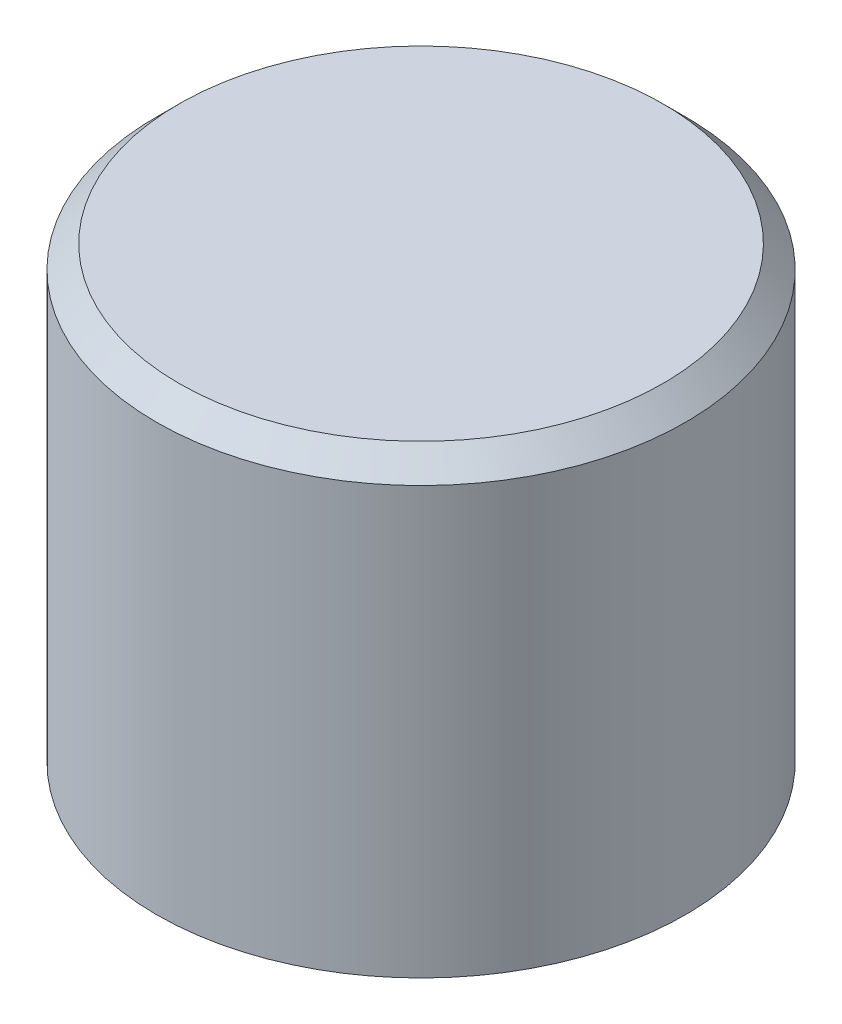
ISO-10303-21;
HEADER;
FILE_DESCRIPTION(('STEP AP214'),'2;1');
FILE_NAME('part.step','',(''),(''),'','','');
FILE_SCHEMA(('AUTOMOTIVE_DESIGN { 1 0 10303 214 1 1 1 1 }'));
ENDSEC;
DATA;
#1=APPLICATION_CONTEXT('core data for automotive mechanical design processes');
#2=APPLICATION_PROTOCOL_DEFINITION('international standard','automotive_design',2000,#1);
#3=PRODUCT_CONTEXT('',#1,'mechanical');
#4=PRODUCT('Part','Part','',(#3));
#5=PRODUCT_RELATED_PRODUCT_CATEGORY('part','',(#4));
#6=PRODUCT_DEFINITION_FORMATION('','',#4);
#7=PRODUCT_DEFINITION_CONTEXT('part definition',#1,'design');
#8=PRODUCT_DEFINITION('design','',#6,#7);
#9=PRODUCT_DEFINITION_SHAPE('','',#8);
#10=(LENGTH_UNIT() NAMED_UNIT(*) SI_UNIT(.MILLI.,.METRE.));
#11=(NAMED_UNIT(*) PLANE_ANGLE_UNIT() SI_UNIT($,.RADIAN.));
#12=(NAMED_UNIT(*) SI_UNIT($,.STERADIAN.) SOLID_ANGLE_UNIT());
#13=UNCERTAINTY_MEASURE_WITH_UNIT(LENGTH_MEASURE(1.E-05),#10,'distance_accuracy_value','');
#14=(GEOMETRIC_REPRESENTATION_CONTEXT(3) GLOBAL_UNCERTAINTY_ASSIGNED_CONTEXT((#13)) GLOBAL_UNIT_ASSIGNED_CONTEXT((#10,
#11,#12)) REPRESENTATION_CONTEXT('',''));
#15=CARTESIAN_POINT('',(0.,0.,0.));
#16=DIRECTION('',(0.,0.,1.));
#17=DIRECTION('',(1.,0.,0.));
#18=AXIS2_PLACEMENT_3D('',#15,#16,#17);
#19=CARTESIAN_POINT('',(0.,14.,0.));
#20=DIRECTION('',(0.,-1.,0.));
#21=DIRECTION('',(0.,0.,-1.));
#22=AXIS2_PLACEMENT_3D('',#19,#20,#21);
#23=CYLINDRICAL_SURFACE('',#22,8.25);
#24=CARTESIAN_POINT('',(0.,13.3,0.));
#25=DIRECTION('',(0.,1.,0.));
#26=DIRECTION('',(0.,0.,1.));
#27=AXIS2_PLACEMENT_3D('',#24,#25,#26);
#28=CIRCLE('',#27,8.25);
#29=CARTESIAN_POINT('',(0.,13.3,8.25));
#30=VERTEX_POINT('',#29);
#31=EDGE_CURVE('E10',#30,#30,#28,.F.);
#32=ORIENTED_EDGE('',*,*,#31,.T.);
#33=EDGE_LOOP('',(#32));
#34=FACE_BOUND('',#33,.T.);
#35=CARTESIAN_POINT('',(0.,0.,0.));
#36=DIRECTION('',(0.,1.,0.));
#37=DIRECTION('',(0.,0.,1.));
#38=AXIS2_PLACEMENT_3D('',#35,#36,#37);
#39=CIRCLE('',#38,8.25);
#40=CARTESIAN_POINT('',(0.,0.,8.25));
#41=VERTEX_POINT('',#40);
#42=EDGE_CURVE('E45',#41,#41,#39,.T.);
#43=ORIENTED_EDGE('',*,*,#42,.T.);
#44=EDGE_LOOP('',(#43));
#45=FACE_BOUND('',#44,.T.);
#46=ADVANCED_FACE('F33',(#34,#45),#23,.T.);
#47=CARTESIAN_POINT('',(0.,14.,0.));
#48=DIRECTION('',(0.,1.,0.));
#49=DIRECTION('',(0.,0.,1.));
#50=AXIS2_PLACEMENT_3D('',#47,#48,#49);
#51=PLANE('',#50);
#52=CARTESIAN_POINT('',(0.,14.,0.));
#53=DIRECTION('',(0.,1.,0.));
#54=DIRECTION('',(0.,0.,1.));
#55=AXIS2_PLACEMENT_3D('',#52,#53,#54);
#56=CIRCLE('',#55,7.55);
#57=CARTESIAN_POINT('',(0.,14.,7.55));
#58=VERTEX_POINT('',#57);
#59=EDGE_CURVE('E41',#58,#58,#56,.T.);
#60=ORIENTED_EDGE('',*,*,#59,.T.);
#61=EDGE_LOOP('',(#60));
#62=FACE_BOUND('',#61,.T.);
#63=ADVANCED_FACE('F55',(#62),#51,.T.);
#64=CARTESIAN_POINT('',(0.,0.,0.));
#65=DIRECTION('',(0.,1.,0.));
#66=DIRECTION('',(0.,0.,1.));
#67=AXIS2_PLACEMENT_3D('',#64,#65,#66);
#68=PLANE('',#67);
#69=ORIENTED_EDGE('',*,*,#42,.F.);
#70=EDGE_LOOP('',(#69));
#71=FACE_BOUND('',#70,.T.);
#72=ADVANCED_FACE('F53',(#71),#68,.F.);
#73=CARTESIAN_POINT('',(0.,14.,0.));
#74=DIRECTION('',(0.,-1.,0.));
#75=DIRECTION('',(0.,0.,-1.));
#76=AXIS2_PLACEMENT_3D('',#73,#74,#75);
#77=CONICAL_SURFACE('',#76,7.55,0.785398163397446);
#78=ORIENTED_EDGE('',*,*,#31,.F.);
#79=EDGE_LOOP('',(#78));
#80=FACE_BOUND('',#79,.T.);
#81=ORIENTED_EDGE('',*,*,#59,.F.);
#82=EDGE_LOOP('',(#81));
#83=FACE_BOUND('',#82,.T.);
#84=ADVANCED_FACE('F36',(#80,#83),#77,.T.);
#85=CLOSED_SHELL('',(#46,#63,#72,#84));
#86=MANIFOLD_SOLID_BREP('B2',#85);
#87=ADVANCED_BREP_SHAPE_REPRESENTATION('',(#18,#86),#14);
#88=SHAPE_DEFINITION_REPRESENTATION(#9,#87);
ENDSEC;
END-ISO-10303-21;
